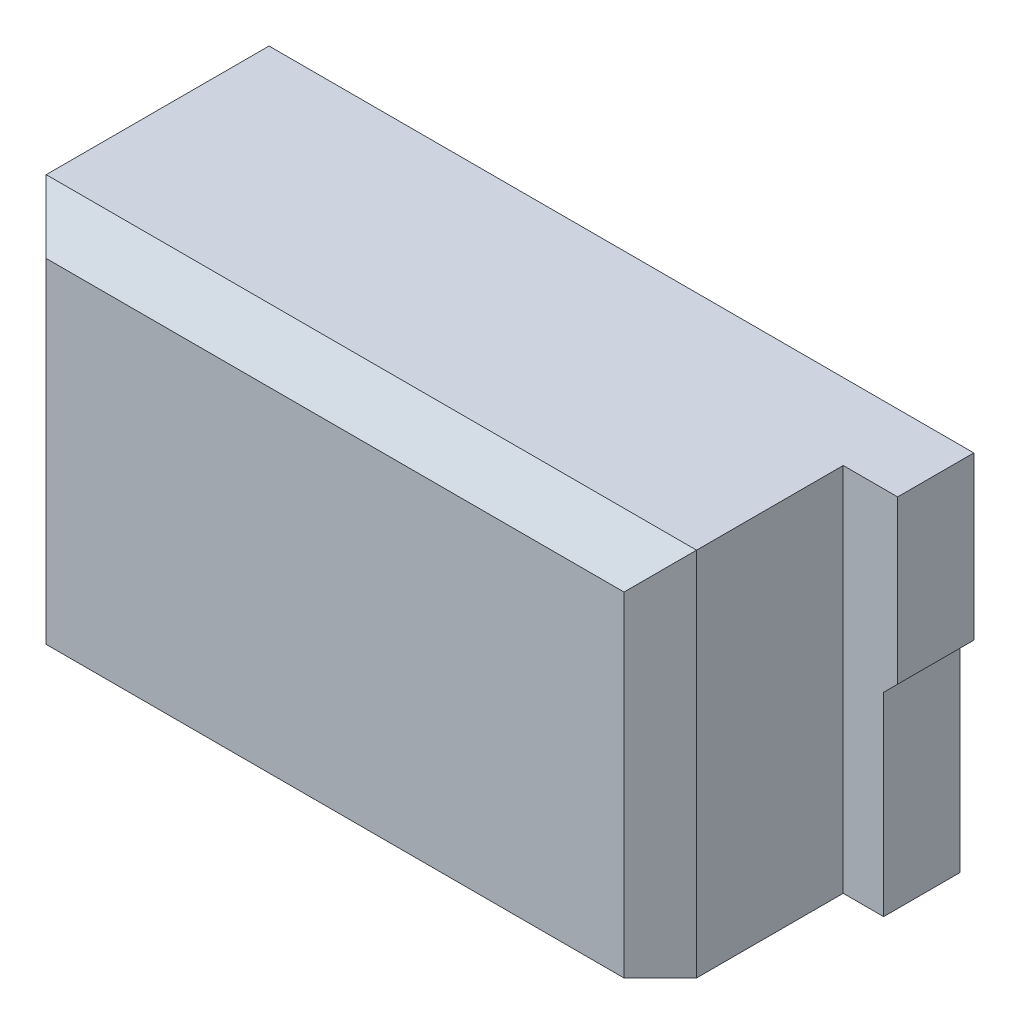
ISO-10303-21;
HEADER;
FILE_DESCRIPTION(('STEP AP214'),'2;1');
FILE_NAME('part.step','',(''),(''),'','','');
FILE_SCHEMA(('AUTOMOTIVE_DESIGN { 1 0 10303 214 1 1 1 1 }'));
ENDSEC;
DATA;
#1=APPLICATION_CONTEXT('core data for automotive mechanical design processes');
#2=APPLICATION_PROTOCOL_DEFINITION('international standard','automotive_design',2000,#1);
#3=PRODUCT_CONTEXT('',#1,'mechanical');
#4=PRODUCT('Part','Part','',(#3));
#5=PRODUCT_RELATED_PRODUCT_CATEGORY('part','',(#4));
#6=PRODUCT_DEFINITION_FORMATION('','',#4);
#7=PRODUCT_DEFINITION_CONTEXT('part definition',#1,'design');
#8=PRODUCT_DEFINITION('design','',#6,#7);
#9=PRODUCT_DEFINITION_SHAPE('','',#8);
#10=(LENGTH_UNIT() NAMED_UNIT(*) SI_UNIT(.MILLI.,.METRE.));
#11=(NAMED_UNIT(*) PLANE_ANGLE_UNIT() SI_UNIT($,.RADIAN.));
#12=(NAMED_UNIT(*) SI_UNIT($,.STERADIAN.) SOLID_ANGLE_UNIT());
#13=UNCERTAINTY_MEASURE_WITH_UNIT(LENGTH_MEASURE(1.E-05),#10,'distance_accuracy_value','');
#14=(GEOMETRIC_REPRESENTATION_CONTEXT(3) GLOBAL_UNCERTAINTY_ASSIGNED_CONTEXT((#13)) GLOBAL_UNIT_ASSIGNED_CONTEXT((#10,
#11,#12)) REPRESENTATION_CONTEXT('',''));
#15=CARTESIAN_POINT('',(0.,0.,0.));
#16=DIRECTION('',(0.,0.,1.));
#17=DIRECTION('',(1.,0.,0.));
#18=AXIS2_PLACEMENT_3D('',#15,#16,#17);
#19=CARTESIAN_POINT('',(64.75,-27.75,0.));
#20=DIRECTION('',(0.,0.,1.));
#21=DIRECTION('',(1.,0.,0.));
#22=AXIS2_PLACEMENT_3D('',#19,#20,#21);
#23=CYLINDRICAL_SURFACE('',#22,2.6);
#24=DIRECTION('',(0.,0.,1.));
#25=VECTOR('',#24,1.);
#26=CARTESIAN_POINT('',(62.15,-27.75,0.));
#27=LINE('',#26,#25);
#28=CARTESIAN_POINT('',(62.15,-27.75,0.));
#29=VERTEX_POINT('',#28);
#30=CARTESIAN_POINT('',(62.15,-27.75,3.1));
#31=VERTEX_POINT('',#30);
#32=EDGE_CURVE('E233',#29,#31,#27,.T.);
#33=ORIENTED_EDGE('',*,*,#32,.F.);
#34=CARTESIAN_POINT('',(64.75,-27.75,0.));
#35=DIRECTION('',(0.,0.,1.));
#36=DIRECTION('',(1.,0.,0.));
#37=AXIS2_PLACEMENT_3D('',#34,#35,#36);
#38=CIRCLE('',#37,2.6);
#39=CARTESIAN_POINT('',(67.35,-27.75,0.));
#40=VERTEX_POINT('',#39);
#41=EDGE_CURVE('E232',#40,#29,#38,.T.);
#42=ORIENTED_EDGE('',*,*,#41,.F.);
#43=DIRECTION('',(0.,0.,1.));
#44=VECTOR('',#43,1.);
#45=CARTESIAN_POINT('',(67.35,-27.75,0.));
#46=LINE('',#45,#44);
#47=CARTESIAN_POINT('',(67.35,-27.75,3.1));
#48=VERTEX_POINT('',#47);
#49=EDGE_CURVE('E430',#40,#48,#46,.T.);
#50=ORIENTED_EDGE('',*,*,#49,.T.);
#51=CARTESIAN_POINT('',(64.75,-27.75,3.1));
#52=DIRECTION('',(0.,0.,1.));
#53=DIRECTION('',(1.,0.,0.));
#54=AXIS2_PLACEMENT_3D('',#51,#52,#53);
#55=CIRCLE('',#54,2.6);
#56=EDGE_CURVE('E11',#48,#31,#55,.T.);
#57=ORIENTED_EDGE('',*,*,#56,.T.);
#58=EDGE_LOOP('',(#33,#42,#50,#57));
#59=FACE_BOUND('',#58,.T.);
#60=ADVANCED_FACE('F17',(#59),#23,.F.);
#61=CARTESIAN_POINT('',(64.75,-27.75,3.1));
#62=DIRECTION('',(0.,0.,-1.));
#63=DIRECTION('',(0.,-1.,0.));
#64=AXIS2_PLACEMENT_3D('',#61,#62,#63);
#65=PLANE('',#64);
#66=ORIENTED_EDGE('',*,*,#56,.F.);
#67=CARTESIAN_POINT('',(64.75,-27.75,3.1));
#68=DIRECTION('',(0.,0.,1.));
#69=DIRECTION('',(1.,0.,0.));
#70=AXIS2_PLACEMENT_3D('',#67,#68,#69);
#71=CIRCLE('',#70,2.6);
#72=EDGE_CURVE('E237',#31,#48,#71,.T.);
#73=ORIENTED_EDGE('',*,*,#72,.F.);
#74=EDGE_LOOP('',(#66,#73));
#75=FACE_BOUND('',#74,.T.);
#76=ADVANCED_FACE('F966',(#75),#65,.T.);
#77=CARTESIAN_POINT('',(-54.75,27.75,0.));
#78=DIRECTION('',(0.,0.,1.));
#79=DIRECTION('',(1.,0.,0.));
#80=AXIS2_PLACEMENT_3D('',#77,#78,#79);
#81=CYLINDRICAL_SURFACE('',#80,2.6);
#82=DIRECTION('',(0.,0.,1.));
#83=VECTOR('',#82,1.);
#84=CARTESIAN_POINT('',(-57.35,27.75,0.));
#85=LINE('',#84,#83);
#86=CARTESIAN_POINT('',(-57.35,27.75,0.));
#87=VERTEX_POINT('',#86);
#88=CARTESIAN_POINT('',(-57.35,27.75,3.1));
#89=VERTEX_POINT('',#88);
#90=EDGE_CURVE('E239',#87,#89,#85,.T.);
#91=ORIENTED_EDGE('',*,*,#90,.F.);
#92=CARTESIAN_POINT('',(-54.75,27.75,0.));
#93=DIRECTION('',(0.,0.,1.));
#94=DIRECTION('',(1.,0.,0.));
#95=AXIS2_PLACEMENT_3D('',#92,#93,#94);
#96=CIRCLE('',#95,2.6);
#97=CARTESIAN_POINT('',(-52.15,27.75,0.));
#98=VERTEX_POINT('',#97);
#99=EDGE_CURVE('E303',#98,#87,#96,.T.);
#100=ORIENTED_EDGE('',*,*,#99,.F.);
#101=DIRECTION('',(0.,0.,1.));
#102=VECTOR('',#101,1.);
#103=CARTESIAN_POINT('',(-52.15,27.75,0.));
#104=LINE('',#103,#102);
#105=CARTESIAN_POINT('',(-52.15,27.75,3.1));
#106=VERTEX_POINT('',#105);
#107=EDGE_CURVE('E399',#98,#106,#104,.T.);
#108=ORIENTED_EDGE('',*,*,#107,.T.);
#109=CARTESIAN_POINT('',(-54.75,27.75,3.1));
#110=DIRECTION('',(0.,0.,1.));
#111=DIRECTION('',(1.,0.,0.));
#112=AXIS2_PLACEMENT_3D('',#109,#110,#111);
#113=CIRCLE('',#112,2.6);
#114=EDGE_CURVE('E28',#106,#89,#113,.T.);
#115=ORIENTED_EDGE('',*,*,#114,.T.);
#116=EDGE_LOOP('',(#91,#100,#108,#115));
#117=FACE_BOUND('',#116,.T.);
#118=ADVANCED_FACE('F1025',(#117),#81,.F.);
#119=CARTESIAN_POINT('',(-54.75,27.75,3.1));
#120=DIRECTION('',(0.,0.,-1.));
#121=DIRECTION('',(0.,-1.,0.));
#122=AXIS2_PLACEMENT_3D('',#119,#120,#121);
#123=PLANE('',#122);
#124=ORIENTED_EDGE('',*,*,#114,.F.);
#125=CARTESIAN_POINT('',(-54.75,27.75,3.1));
#126=DIRECTION('',(0.,0.,1.));
#127=DIRECTION('',(1.,0.,0.));
#128=AXIS2_PLACEMENT_3D('',#125,#126,#127);
#129=CIRCLE('',#128,2.6);
#130=EDGE_CURVE('E243',#89,#106,#129,.T.);
#131=ORIENTED_EDGE('',*,*,#130,.F.);
#132=EDGE_LOOP('',(#124,#131));
#133=FACE_BOUND('',#132,.T.);
#134=ADVANCED_FACE('F1307',(#133),#123,.T.);
#135=CARTESIAN_POINT('',(64.75,27.75,0.));
#136=DIRECTION('',(0.,0.,1.));
#137=DIRECTION('',(1.,0.,0.));
#138=AXIS2_PLACEMENT_3D('',#135,#136,#137);
#139=CYLINDRICAL_SURFACE('',#138,2.6);
#140=DIRECTION('',(0.,0.,1.));
#141=VECTOR('',#140,1.);
#142=CARTESIAN_POINT('',(62.15,27.75,0.));
#143=LINE('',#142,#141);
#144=CARTESIAN_POINT('',(62.15,27.75,0.));
#145=VERTEX_POINT('',#144);
#146=CARTESIAN_POINT('',(62.15,27.75,3.1));
#147=VERTEX_POINT('',#146);
#148=EDGE_CURVE('E429',#145,#147,#143,.T.);
#149=ORIENTED_EDGE('',*,*,#148,.F.);
#150=CARTESIAN_POINT('',(64.75,27.75,0.));
#151=DIRECTION('',(0.,0.,1.));
#152=DIRECTION('',(1.,0.,0.));
#153=AXIS2_PLACEMENT_3D('',#150,#151,#152);
#154=CIRCLE('',#153,2.6);
#155=CARTESIAN_POINT('',(67.35,27.75,0.));
#156=VERTEX_POINT('',#155);
#157=EDGE_CURVE('E307',#156,#145,#154,.T.);
#158=ORIENTED_EDGE('',*,*,#157,.F.);
#159=DIRECTION('',(0.,0.,1.));
#160=VECTOR('',#159,1.);
#161=CARTESIAN_POINT('',(67.35,27.75,0.));
#162=LINE('',#161,#160);
#163=CARTESIAN_POINT('',(67.35,27.75,3.1));
#164=VERTEX_POINT('',#163);
#165=EDGE_CURVE('E266',#156,#164,#162,.T.);
#166=ORIENTED_EDGE('',*,*,#165,.T.);
#167=CARTESIAN_POINT('',(64.75,27.75,3.1));
#168=DIRECTION('',(0.,0.,1.));
#169=DIRECTION('',(1.,0.,0.));
#170=AXIS2_PLACEMENT_3D('',#167,#168,#169);
#171=CIRCLE('',#170,2.6);
#172=EDGE_CURVE('E224',#164,#147,#171,.T.);
#173=ORIENTED_EDGE('',*,*,#172,.T.);
#174=EDGE_LOOP('',(#149,#158,#166,#173));
#175=FACE_BOUND('',#174,.T.);
#176=ADVANCED_FACE('F1055',(#175),#139,.F.);
#177=CARTESIAN_POINT('',(64.75,27.75,3.1));
#178=DIRECTION('',(0.,0.,-1.));
#179=DIRECTION('',(0.,-1.,0.));
#180=AXIS2_PLACEMENT_3D('',#177,#178,#179);
#181=PLANE('',#180);
#182=ORIENTED_EDGE('',*,*,#172,.F.);
#183=CARTESIAN_POINT('',(64.75,27.75,3.1));
#184=DIRECTION('',(0.,0.,1.));
#185=DIRECTION('',(1.,0.,0.));
#186=AXIS2_PLACEMENT_3D('',#183,#184,#185);
#187=CIRCLE('',#186,2.6);
#188=EDGE_CURVE('E370',#147,#164,#187,.T.);
#189=ORIENTED_EDGE('',*,*,#188,.F.);
#190=EDGE_LOOP('',(#182,#189));
#191=FACE_BOUND('',#190,.T.);
#192=ADVANCED_FACE('F1049',(#191),#181,.T.);
#193=CARTESIAN_POINT('',(-54.75,-27.75,0.));
#194=DIRECTION('',(0.,0.,1.));
#195=DIRECTION('',(1.,0.,0.));
#196=AXIS2_PLACEMENT_3D('',#193,#194,#195);
#197=CYLINDRICAL_SURFACE('',#196,2.6);
#198=DIRECTION('',(0.,0.,1.));
#199=VECTOR('',#198,1.);
#200=CARTESIAN_POINT('',(-57.35,-27.75,0.));
#201=LINE('',#200,#199);
#202=CARTESIAN_POINT('',(-57.35,-27.75,0.));
#203=VERTEX_POINT('',#202);
#204=CARTESIAN_POINT('',(-57.35,-27.75,3.1));
#205=VERTEX_POINT('',#204);
#206=EDGE_CURVE('E260',#203,#205,#201,.T.);
#207=ORIENTED_EDGE('',*,*,#206,.F.);
#208=CARTESIAN_POINT('',(-54.75,-27.75,0.));
#209=DIRECTION('',(0.,0.,1.));
#210=DIRECTION('',(1.,0.,0.));
#211=AXIS2_PLACEMENT_3D('',#208,#209,#210);
#212=CIRCLE('',#211,2.6);
#213=CARTESIAN_POINT('',(-52.15,-27.75,0.));
#214=VERTEX_POINT('',#213);
#215=EDGE_CURVE('E420',#214,#203,#212,.T.);
#216=ORIENTED_EDGE('',*,*,#215,.F.);
#217=DIRECTION('',(0.,0.,1.));
#218=VECTOR('',#217,1.);
#219=CARTESIAN_POINT('',(-52.15,-27.75,0.));
#220=LINE('',#219,#218);
#221=CARTESIAN_POINT('',(-52.15,-27.75,3.1));
#222=VERTEX_POINT('',#221);
#223=EDGE_CURVE('E259',#214,#222,#220,.T.);
#224=ORIENTED_EDGE('',*,*,#223,.T.);
#225=CARTESIAN_POINT('',(-54.75,-27.75,3.1));
#226=DIRECTION('',(0.,0.,1.));
#227=DIRECTION('',(1.,0.,0.));
#228=AXIS2_PLACEMENT_3D('',#225,#226,#227);
#229=CIRCLE('',#228,2.6);
#230=EDGE_CURVE('E220',#222,#205,#229,.T.);
#231=ORIENTED_EDGE('',*,*,#230,.T.);
#232=EDGE_LOOP('',(#207,#216,#224,#231));
#233=FACE_BOUND('',#232,.T.);
#234=ADVANCED_FACE('F1054',(#233),#197,.F.);
#235=CARTESIAN_POINT('',(-54.75,-27.75,3.1));
#236=DIRECTION('',(0.,0.,-1.));
#237=DIRECTION('',(0.,-1.,0.));
#238=AXIS2_PLACEMENT_3D('',#235,#236,#237);
#239=PLANE('',#238);
#240=ORIENTED_EDGE('',*,*,#230,.F.);
#241=CARTESIAN_POINT('',(-54.75,-27.75,3.1));
#242=DIRECTION('',(0.,0.,1.));
#243=DIRECTION('',(1.,0.,0.));
#244=AXIS2_PLACEMENT_3D('',#241,#242,#243);
#245=CIRCLE('',#244,2.6);
#246=EDGE_CURVE('E255',#205,#222,#245,.T.);
#247=ORIENTED_EDGE('',*,*,#246,.F.);
#248=EDGE_LOOP('',(#240,#247));
#249=FACE_BOUND('',#248,.T.);
#250=ADVANCED_FACE('F1011',(#249),#239,.T.);
#251=CARTESIAN_POINT('',(-49.75,22.75,0.));
#252=DIRECTION('',(1.,0.,0.));
#253=DIRECTION('',(0.,1.,0.));
#254=AXIS2_PLACEMENT_3D('',#251,#252,#253);
#255=PLANE('',#254);
#256=DIRECTION('',(0.,-1.,0.));
#257=VECTOR('',#256,1.);
#258=CARTESIAN_POINT('',(-49.75,32.75,0.));
#259=LINE('',#258,#257);
#260=CARTESIAN_POINT('',(-49.75,32.75,0.));
#261=VERTEX_POINT('',#260);
#262=CARTESIAN_POINT('',(-49.75,22.75,0.));
#263=VERTEX_POINT('',#262);
#264=EDGE_CURVE('E511',#261,#263,#259,.T.);
#265=ORIENTED_EDGE('',*,*,#264,.F.);
#266=DIRECTION('',(0.,0.,-1.));
#267=VECTOR('',#266,1.);
#268=CARTESIAN_POINT('',(-49.75,32.75,0.));
#269=LINE('',#268,#267);
#270=CARTESIAN_POINT('',(-49.75,32.75,10.));
#271=VERTEX_POINT('',#270);
#272=EDGE_CURVE('E280',#271,#261,#269,.T.);
#273=ORIENTED_EDGE('',*,*,#272,.F.);
#274=DIRECTION('',(0.,1.,0.));
#275=VECTOR('',#274,1.);
#276=CARTESIAN_POINT('',(-49.75,32.75,10.));
#277=LINE('',#276,#275);
#278=CARTESIAN_POINT('',(-49.75,22.75,10.));
#279=VERTEX_POINT('',#278);
#280=EDGE_CURVE('E212',#279,#271,#277,.T.);
#281=ORIENTED_EDGE('',*,*,#280,.F.);
#282=DIRECTION('',(0.,0.,1.));
#283=VECTOR('',#282,1.);
#284=CARTESIAN_POINT('',(-49.75,22.75,0.));
#285=LINE('',#284,#283);
#286=EDGE_CURVE('E43',#263,#279,#285,.T.);
#287=ORIENTED_EDGE('',*,*,#286,.F.);
#288=EDGE_LOOP('',(#265,#273,#281,#287));
#289=FACE_BOUND('',#288,.T.);
#290=ADVANCED_FACE('F1000',(#289),#255,.T.);
#291=CARTESIAN_POINT('',(-59.75,22.75,0.));
#292=DIRECTION('',(0.,-1.,0.));
#293=DIRECTION('',(0.,0.,-1.));
#294=AXIS2_PLACEMENT_3D('',#291,#292,#293);
#295=PLANE('',#294);
#296=DIRECTION('',(-1.,0.,0.));
#297=VECTOR('',#296,1.);
#298=CARTESIAN_POINT('',(-49.75,22.75,0.));
#299=LINE('',#298,#297);
#300=CARTESIAN_POINT('',(-59.75,22.75,0.));
#301=VERTEX_POINT('',#300);
#302=EDGE_CURVE('E21',#263,#301,#299,.T.);
#303=ORIENTED_EDGE('',*,*,#302,.F.);
#304=ORIENTED_EDGE('',*,*,#286,.T.);
#305=DIRECTION('',(1.,0.,0.));
#306=VECTOR('',#305,1.);
#307=CARTESIAN_POINT('',(-49.75,22.75,10.));
#308=LINE('',#307,#306);
#309=CARTESIAN_POINT('',(-59.75,22.75,10.));
#310=VERTEX_POINT('',#309);
#311=EDGE_CURVE('E208',#310,#279,#308,.T.);
#312=ORIENTED_EDGE('',*,*,#311,.F.);
#313=DIRECTION('',(0.,0.,1.));
#314=VECTOR('',#313,1.);
#315=CARTESIAN_POINT('',(-59.75,22.75,0.));
#316=LINE('',#315,#314);
#317=EDGE_CURVE('E191',#301,#310,#316,.T.);
#318=ORIENTED_EDGE('',*,*,#317,.F.);
#319=EDGE_LOOP('',(#303,#304,#312,#318));
#320=FACE_BOUND('',#319,.T.);
#321=ADVANCED_FACE('F1001',(#320),#295,.T.);
#322=CARTESIAN_POINT('',(-54.75,27.75,10.));
#323=DIRECTION('',(0.,0.,1.));
#324=DIRECTION('',(1.,0.,0.));
#325=AXIS2_PLACEMENT_3D('',#322,#323,#324);
#326=PLANE('',#325);
#327=DIRECTION('',(0.,1.,0.));
#328=VECTOR('',#327,1.);
#329=CARTESIAN_POINT('',(-59.75,31.75,10.));
#330=LINE('',#329,#328);
#331=CARTESIAN_POINT('',(-59.75,32.75,10.));
#332=VERTEX_POINT('',#331);
#333=EDGE_CURVE('E332',#310,#332,#330,.T.);
#334=ORIENTED_EDGE('',*,*,#333,.F.);
#335=ORIENTED_EDGE('',*,*,#311,.T.);
#336=ORIENTED_EDGE('',*,*,#280,.T.);
#337=DIRECTION('',(1.,0.,0.));
#338=VECTOR('',#337,1.);
#339=CARTESIAN_POINT('',(3.99999999999995,32.75,10.));
#340=LINE('',#339,#338);
#341=EDGE_CURVE('E321',#332,#271,#340,.T.);
#342=ORIENTED_EDGE('',*,*,#341,.F.);
#343=EDGE_LOOP('',(#334,#335,#336,#342));
#344=FACE_BOUND('',#343,.T.);
#345=ADVANCED_FACE('F1163',(#344),#326,.T.);
#346=CARTESIAN_POINT('',(-49.75,-32.75,0.));
#347=DIRECTION('',(1.,0.,0.));
#348=DIRECTION('',(0.,1.,0.));
#349=AXIS2_PLACEMENT_3D('',#346,#347,#348);
#350=PLANE('',#349);
#351=DIRECTION('',(0.,1.,0.));
#352=VECTOR('',#351,1.);
#353=CARTESIAN_POINT('',(-49.75,-32.75,0.));
#354=LINE('',#353,#352);
#355=CARTESIAN_POINT('',(-49.75,-32.75,0.));
#356=VERTEX_POINT('',#355);
#357=CARTESIAN_POINT('',(-49.75,-22.75,0.));
#358=VERTEX_POINT('',#357);
#359=EDGE_CURVE('E461',#356,#358,#354,.T.);
#360=ORIENTED_EDGE('',*,*,#359,.T.);
#361=DIRECTION('',(0.,0.,1.));
#362=VECTOR('',#361,1.);
#363=CARTESIAN_POINT('',(-49.75,-22.75,0.));
#364=LINE('',#363,#362);
#365=CARTESIAN_POINT('',(-49.75,-22.75,10.));
#366=VERTEX_POINT('',#365);
#367=EDGE_CURVE('E213',#358,#366,#364,.T.);
#368=ORIENTED_EDGE('',*,*,#367,.T.);
#369=DIRECTION('',(0.,1.,0.));
#370=VECTOR('',#369,1.);
#371=CARTESIAN_POINT('',(-49.75,-32.75,10.));
#372=LINE('',#371,#370);
#373=CARTESIAN_POINT('',(-49.75,-32.75,10.));
#374=VERTEX_POINT('',#373);
#375=EDGE_CURVE('E405',#374,#366,#372,.T.);
#376=ORIENTED_EDGE('',*,*,#375,.F.);
#377=DIRECTION('',(0.,0.,1.));
#378=VECTOR('',#377,1.);
#379=CARTESIAN_POINT('',(-49.75,-32.75,0.));
#380=LINE('',#379,#378);
#381=EDGE_CURVE('E358',#356,#374,#380,.T.);
#382=ORIENTED_EDGE('',*,*,#381,.F.);
#383=EDGE_LOOP('',(#360,#368,#376,#382));
#384=FACE_BOUND('',#383,.T.);
#385=ADVANCED_FACE('F19',(#384),#350,.T.);
#386=CARTESIAN_POINT('',(-49.75,-22.75,0.));
#387=DIRECTION('',(0.,1.,0.));
#388=DIRECTION('',(1.,0.,0.));
#389=AXIS2_PLACEMENT_3D('',#386,#387,#388);
#390=PLANE('',#389);
#391=DIRECTION('',(-1.,0.,0.));
#392=VECTOR('',#391,1.);
#393=CARTESIAN_POINT('',(-49.75,-22.75,0.));
#394=LINE('',#393,#392);
#395=CARTESIAN_POINT('',(-59.75,-22.75,0.));
#396=VERTEX_POINT('',#395);
#397=EDGE_CURVE('E336',#358,#396,#394,.T.);
#398=ORIENTED_EDGE('',*,*,#397,.T.);
#399=DIRECTION('',(0.,0.,-1.));
#400=VECTOR('',#399,1.);
#401=CARTESIAN_POINT('',(-59.75,-22.75,0.));
#402=LINE('',#401,#400);
#403=CARTESIAN_POINT('',(-59.75,-22.75,10.));
#404=VERTEX_POINT('',#403);
#405=EDGE_CURVE('E199',#404,#396,#402,.T.);
#406=ORIENTED_EDGE('',*,*,#405,.F.);
#407=DIRECTION('',(-1.,0.,0.));
#408=VECTOR('',#407,1.);
#409=CARTESIAN_POINT('',(-49.75,-22.75,10.));
#410=LINE('',#409,#408);
#411=EDGE_CURVE('E357',#366,#404,#410,.T.);
#412=ORIENTED_EDGE('',*,*,#411,.F.);
#413=ORIENTED_EDGE('',*,*,#367,.F.);
#414=EDGE_LOOP('',(#398,#406,#412,#413));
#415=FACE_BOUND('',#414,.T.);
#416=ADVANCED_FACE('F991',(#415),#390,.T.);
#417=CARTESIAN_POINT('',(-54.75,-27.75,10.));
#418=DIRECTION('',(0.,0.,1.));
#419=DIRECTION('',(1.,0.,0.));
#420=AXIS2_PLACEMENT_3D('',#417,#418,#419);
#421=PLANE('',#420);
#422=ORIENTED_EDGE('',*,*,#411,.T.);
#423=DIRECTION('',(0.,1.,0.));
#424=VECTOR('',#423,1.);
#425=CARTESIAN_POINT('',(-59.75,4.,10.));
#426=LINE('',#425,#424);
#427=CARTESIAN_POINT('',(-59.75,-32.75,10.));
#428=VERTEX_POINT('',#427);
#429=EDGE_CURVE('E376',#428,#404,#426,.T.);
#430=ORIENTED_EDGE('',*,*,#429,.F.);
#431=DIRECTION('',(-1.,0.,0.));
#432=VECTOR('',#431,1.);
#433=CARTESIAN_POINT('',(-58.75,-32.75,10.));
#434=LINE('',#433,#432);
#435=EDGE_CURVE('E353',#374,#428,#434,.T.);
#436=ORIENTED_EDGE('',*,*,#435,.F.);
#437=ORIENTED_EDGE('',*,*,#375,.T.);
#438=EDGE_LOOP('',(#422,#430,#436,#437));
#439=FACE_BOUND('',#438,.T.);
#440=ADVANCED_FACE('F1149',(#439),#421,.T.);
#441=CARTESIAN_POINT('',(-62.75,-32.75,0.));
#442=DIRECTION('',(0.,-1.,0.));
#443=DIRECTION('',(0.,0.,-1.));
#444=AXIS2_PLACEMENT_3D('',#441,#442,#443);
#445=PLANE('',#444);
#446=CARTESIAN_POINT('',(33.25,-32.75,23.5));
#447=DIRECTION('',(0.,-1.,0.));
#448=DIRECTION('',(1.,0.,0.));
#449=AXIS2_PLACEMENT_3D('',#446,#447,#448);
#450=CIRCLE('',#449,17.5);
#451=CARTESIAN_POINT('',(50.75,-32.75,23.5));
#452=VERTEX_POINT('',#451);
#453=CARTESIAN_POINT('',(15.75,-32.75,23.5));
#454=VERTEX_POINT('',#453);
#455=EDGE_CURVE('E504',#452,#454,#450,.T.);
#456=ORIENTED_EDGE('',*,*,#455,.T.);
#457=CARTESIAN_POINT('',(33.25,-32.75,23.5));
#458=DIRECTION('',(0.,-1.,0.));
#459=DIRECTION('',(1.,0.,0.));
#460=AXIS2_PLACEMENT_3D('',#457,#458,#459);
#461=CIRCLE('',#460,17.5);
#462=EDGE_CURVE('E362',#454,#452,#461,.T.);
#463=ORIENTED_EDGE('',*,*,#462,.T.);
#464=EDGE_LOOP('',(#456,#463));
#465=FACE_BOUND('',#464,.T.);
#466=ORIENTED_EDGE('',*,*,#381,.T.);
#467=ORIENTED_EDGE('',*,*,#435,.T.);
#468=DIRECTION('',(0.,0.,1.));
#469=VECTOR('',#468,1.);
#470=CARTESIAN_POINT('',(-59.75,-32.75,0.));
#471=LINE('',#470,#469);
#472=CARTESIAN_POINT('',(-59.75,-32.75,41.7573593128807));
#473=VERTEX_POINT('',#472);
#474=EDGE_CURVE('E380',#428,#473,#471,.T.);
#475=ORIENTED_EDGE('',*,*,#474,.T.);
#476=DIRECTION('',(0.707106781186548,0.,0.707106781186548));
#477=VECTOR('',#476,1.);
#478=CARTESIAN_POINT('',(-69.6286796564404,-32.75,31.8786796564404));
#479=LINE('',#478,#477);
#480=CARTESIAN_POINT('',(-54.5073593128808,-32.75,47.));
#481=VERTEX_POINT('',#480);
#482=EDGE_CURVE('E181',#473,#481,#479,.T.);
#483=ORIENTED_EDGE('',*,*,#482,.T.);
#484=DIRECTION('',(1.,0.,0.));
#485=VECTOR('',#484,1.);
#486=CARTESIAN_POINT('',(-31.375,-32.75,47.));
#487=LINE('',#486,#485);
#488=CARTESIAN_POINT('',(54.5073593128807,-32.75,47.));
#489=VERTEX_POINT('',#488);
#490=EDGE_CURVE('E177',#481,#489,#487,.T.);
#491=ORIENTED_EDGE('',*,*,#490,.T.);
#492=DIRECTION('',(0.707106781186548,0.,-0.707106781186548));
#493=VECTOR('',#492,1.);
#494=CARTESIAN_POINT('',(38.2536796564403,-32.75,63.2536796564404));
#495=LINE('',#494,#493);
#496=CARTESIAN_POINT('',(59.75,-32.75,41.7573593128807));
#497=VERTEX_POINT('',#496);
#498=EDGE_CURVE('E163',#489,#497,#495,.T.);
#499=ORIENTED_EDGE('',*,*,#498,.T.);
#500=DIRECTION('',(0.,0.,1.));
#501=VECTOR('',#500,1.);
#502=CARTESIAN_POINT('',(59.75,-32.75,0.));
#503=LINE('',#502,#501);
#504=CARTESIAN_POINT('',(59.75,-32.75,0.));
#505=VERTEX_POINT('',#504);
#506=EDGE_CURVE('E270',#505,#497,#503,.T.);
#507=ORIENTED_EDGE('',*,*,#506,.F.);
#508=DIRECTION('',(1.,0.,0.));
#509=VECTOR('',#508,1.);
#510=CARTESIAN_POINT('',(-31.375,-32.75,0.));
#511=LINE('',#510,#509);
#512=EDGE_CURVE('E298',#356,#505,#511,.T.);
#513=ORIENTED_EDGE('',*,*,#512,.F.);
#514=EDGE_LOOP('',(#466,#467,#475,#483,#491,#499,#507,#513));
#515=FACE_BOUND('',#514,.T.);
#516=ADVANCED_FACE('F179',(#465,#515),#445,.F.);
#517=CARTESIAN_POINT('',(33.25,-35.75,23.5));
#518=DIRECTION('',(0.,1.,0.));
#519=DIRECTION('',(1.,0.,0.));
#520=AXIS2_PLACEMENT_3D('',#517,#518,#519);
#521=CYLINDRICAL_SURFACE('',#520,17.5);
#522=DIRECTION('',(0.,1.,0.));
#523=VECTOR('',#522,1.);
#524=CARTESIAN_POINT('',(15.75,-35.75,23.5));
#525=LINE('',#524,#523);
#526=CARTESIAN_POINT('',(15.75,-35.75,23.5));
#527=VERTEX_POINT('',#526);
#528=EDGE_CURVE('E500',#527,#454,#525,.T.);
#529=ORIENTED_EDGE('',*,*,#528,.F.);
#530=CARTESIAN_POINT('',(33.25,-35.75,23.5));
#531=DIRECTION('',(0.,1.,0.));
#532=DIRECTION('',(1.,0.,0.));
#533=AXIS2_PLACEMENT_3D('',#530,#531,#532);
#534=CIRCLE('',#533,17.5);
#535=CARTESIAN_POINT('',(50.75,-35.75,23.5));
#536=VERTEX_POINT('',#535);
#537=EDGE_CURVE('E308',#536,#527,#534,.T.);
#538=ORIENTED_EDGE('',*,*,#537,.F.);
#539=DIRECTION('',(0.,1.,0.));
#540=VECTOR('',#539,1.);
#541=CARTESIAN_POINT('',(50.75,-35.75,23.5));
#542=LINE('',#541,#540);
#543=EDGE_CURVE('E342',#536,#452,#542,.T.);
#544=ORIENTED_EDGE('',*,*,#543,.T.);
#545=ORIENTED_EDGE('',*,*,#462,.F.);
#546=EDGE_LOOP('',(#529,#538,#544,#545));
#547=FACE_BOUND('',#546,.T.);
#548=ADVANCED_FACE('F1221',(#547),#521,.F.);
#549=CARTESIAN_POINT('',(73.25,4.45,0.));
#550=DIRECTION('',(1.,0.,0.));
#551=DIRECTION('',(0.,-1.,0.));
#552=AXIS2_PLACEMENT_3D('',#549,#550,#551);
#553=PLANE('',#552);
#554=DIRECTION('',(0.,1.,0.));
#555=VECTOR('',#554,1.);
#556=CARTESIAN_POINT('',(73.25,4.45,0.));
#557=LINE('',#556,#555);
#558=CARTESIAN_POINT('',(73.25,4.45,0.));
#559=VERTEX_POINT('',#558);
#560=CARTESIAN_POINT('',(73.25,35.75,0.));
#561=VERTEX_POINT('',#560);
#562=EDGE_CURVE('E348',#559,#561,#557,.T.);
#563=ORIENTED_EDGE('',*,*,#562,.T.);
#564=DIRECTION('',(0.,0.,1.));
#565=VECTOR('',#564,1.);
#566=CARTESIAN_POINT('',(73.25,35.75,0.));
#567=LINE('',#566,#565);
#568=CARTESIAN_POINT('',(73.25,35.75,14.7));
#569=VERTEX_POINT('',#568);
#570=EDGE_CURVE('E250',#561,#569,#567,.T.);
#571=ORIENTED_EDGE('',*,*,#570,.T.);
#572=DIRECTION('',(0.,1.,0.));
#573=VECTOR('',#572,1.);
#574=CARTESIAN_POINT('',(73.25,4.45,14.7));
#575=LINE('',#574,#573);
#576=CARTESIAN_POINT('',(73.25,4.45,14.7));
#577=VERTEX_POINT('',#576);
#578=EDGE_CURVE('E392',#577,#569,#575,.T.);
#579=ORIENTED_EDGE('',*,*,#578,.F.);
#580=DIRECTION('',(0.,0.,1.));
#581=VECTOR('',#580,1.);
#582=CARTESIAN_POINT('',(73.25,4.45,0.));
#583=LINE('',#582,#581);
#584=EDGE_CURVE('E366',#559,#577,#583,.T.);
#585=ORIENTED_EDGE('',*,*,#584,.F.);
#586=EDGE_LOOP('',(#563,#571,#579,#585));
#587=FACE_BOUND('',#586,.T.);
#588=ADVANCED_FACE('F689',(#587),#553,.T.);
#589=CARTESIAN_POINT('',(70.55,1.7500000000001,0.));
#590=DIRECTION('',(0.707106781186546,-0.707106781186549,0.));
#591=DIRECTION('',(0.,0.,-1.));
#592=AXIS2_PLACEMENT_3D('',#589,#590,#591);
#593=PLANE('',#592);
#594=DIRECTION('',(0.707106781186549,0.707106781186546,0.));
#595=VECTOR('',#594,1.);
#596=CARTESIAN_POINT('',(70.55,1.7500000000001,0.));
#597=LINE('',#596,#595);
#598=CARTESIAN_POINT('',(70.55,1.7500000000001,0.));
#599=VERTEX_POINT('',#598);
#600=EDGE_CURVE('E343',#599,#559,#597,.T.);
#601=ORIENTED_EDGE('',*,*,#600,.T.);
#602=ORIENTED_EDGE('',*,*,#584,.T.);
#603=DIRECTION('',(0.707106781186549,0.707106781186546,0.));
#604=VECTOR('',#603,1.);
#605=CARTESIAN_POINT('',(70.55,1.7500000000001,14.7));
#606=LINE('',#605,#604);
#607=CARTESIAN_POINT('',(70.55,1.7500000000001,14.7));
#608=VERTEX_POINT('',#607);
#609=EDGE_CURVE('E352',#608,#577,#606,.T.);
#610=ORIENTED_EDGE('',*,*,#609,.F.);
#611=DIRECTION('',(0.,0.,1.));
#612=VECTOR('',#611,1.);
#613=CARTESIAN_POINT('',(70.55,1.7500000000001,0.));
#614=LINE('',#613,#612);
#615=EDGE_CURVE('E393',#599,#608,#614,.T.);
#616=ORIENTED_EDGE('',*,*,#615,.F.);
#617=EDGE_LOOP('',(#601,#602,#610,#616));
#618=FACE_BOUND('',#617,.T.);
#619=ADVANCED_FACE('F678',(#618),#593,.T.);
#620=CARTESIAN_POINT('',(70.55,-35.75,0.));
#621=DIRECTION('',(1.,0.,0.));
#622=DIRECTION('',(0.,1.,0.));
#623=AXIS2_PLACEMENT_3D('',#620,#621,#622);
#624=PLANE('',#623);
#625=DIRECTION('',(0.,1.,0.));
#626=VECTOR('',#625,1.);
#627=CARTESIAN_POINT('',(70.55,-35.75,0.));
#628=LINE('',#627,#626);
#629=CARTESIAN_POINT('',(70.55,-35.75,0.));
#630=VERTEX_POINT('',#629);
#631=EDGE_CURVE('E347',#630,#599,#628,.T.);
#632=ORIENTED_EDGE('',*,*,#631,.T.);
#633=ORIENTED_EDGE('',*,*,#615,.T.);
#634=DIRECTION('',(0.,1.,0.));
#635=VECTOR('',#634,1.);
#636=CARTESIAN_POINT('',(70.55,-35.75,14.7));
#637=LINE('',#636,#635);
#638=CARTESIAN_POINT('',(70.55,-35.75,14.7));
#639=VERTEX_POINT('',#638);
#640=EDGE_CURVE('E207',#639,#608,#637,.T.);
#641=ORIENTED_EDGE('',*,*,#640,.F.);
#642=DIRECTION('',(0.,0.,1.));
#643=VECTOR('',#642,1.);
#644=CARTESIAN_POINT('',(70.55,-35.75,0.));
#645=LINE('',#644,#643);
#646=EDGE_CURVE('E521',#630,#639,#645,.T.);
#647=ORIENTED_EDGE('',*,*,#646,.F.);
#648=EDGE_LOOP('',(#632,#633,#641,#647));
#649=FACE_BOUND('',#648,.T.);
#650=ADVANCED_FACE('F684',(#649),#624,.T.);
#651=CARTESIAN_POINT('',(68.,0.,14.7));
#652=DIRECTION('',(0.,0.,1.));
#653=DIRECTION('',(1.,0.,0.));
#654=AXIS2_PLACEMENT_3D('',#651,#652,#653);
#655=PLANE('',#654);
#656=DIRECTION('',(-1.,0.,0.));
#657=VECTOR('',#656,1.);
#658=CARTESIAN_POINT('',(73.25,35.75,14.7));
#659=LINE('',#658,#657);
#660=CARTESIAN_POINT('',(62.75,35.75,14.7));
#661=VERTEX_POINT('',#660);
#662=EDGE_CURVE('E254',#569,#661,#659,.T.);
#663=ORIENTED_EDGE('',*,*,#662,.T.);
#664=DIRECTION('',(0.,1.,0.));
#665=VECTOR('',#664,1.);
#666=CARTESIAN_POINT('',(62.75,-17.875,14.7));
#667=LINE('',#666,#665);
#668=CARTESIAN_POINT('',(62.75,-35.75,14.7));
#669=VERTEX_POINT('',#668);
#670=EDGE_CURVE('E204',#669,#661,#667,.T.);
#671=ORIENTED_EDGE('',*,*,#670,.F.);
#672=DIRECTION('',(1.,0.,0.));
#673=VECTOR('',#672,1.);
#674=CARTESIAN_POINT('',(62.75,-35.75,14.7));
#675=LINE('',#674,#673);
#676=EDGE_CURVE('E525',#669,#639,#675,.T.);
#677=ORIENTED_EDGE('',*,*,#676,.T.);
#678=ORIENTED_EDGE('',*,*,#640,.T.);
#679=ORIENTED_EDGE('',*,*,#609,.T.);
#680=ORIENTED_EDGE('',*,*,#578,.T.);
#681=EDGE_LOOP('',(#663,#671,#677,#678,#679,#680));
#682=FACE_BOUND('',#681,.T.);
#683=ADVANCED_FACE('F695',(#682),#655,.T.);
#684=CARTESIAN_POINT('',(62.75,-35.75,0.));
#685=DIRECTION('',(1.,0.,0.));
#686=DIRECTION('',(0.,1.,0.));
#687=AXIS2_PLACEMENT_3D('',#684,#685,#686);
#688=PLANE('',#687);
#689=ORIENTED_EDGE('',*,*,#670,.T.);
#690=DIRECTION('',(0.,0.,1.));
#691=VECTOR('',#690,1.);
#692=CARTESIAN_POINT('',(62.75,35.75,0.));
#693=LINE('',#692,#691);
#694=CARTESIAN_POINT('',(62.75,35.75,43.));
#695=VERTEX_POINT('',#694);
#696=EDGE_CURVE('E465',#661,#695,#693,.T.);
#697=ORIENTED_EDGE('',*,*,#696,.T.);
#698=DIRECTION('',(0.,1.,0.));
#699=VECTOR('',#698,1.);
#700=CARTESIAN_POINT('',(62.75,-17.875,43.));
#701=LINE('',#700,#699);
#702=CARTESIAN_POINT('',(62.75,-35.75,43.));
#703=VERTEX_POINT('',#702);
#704=EDGE_CURVE('E245',#703,#695,#701,.T.);
#705=ORIENTED_EDGE('',*,*,#704,.F.);
#706=DIRECTION('',(0.,0.,1.));
#707=VECTOR('',#706,1.);
#708=CARTESIAN_POINT('',(62.75,-35.75,0.));
#709=LINE('',#708,#707);
#710=EDGE_CURVE('E313',#669,#703,#709,.T.);
#711=ORIENTED_EDGE('',*,*,#710,.F.);
#712=EDGE_LOOP('',(#689,#697,#705,#711));
#713=FACE_BOUND('',#712,.T.);
#714=ADVANCED_FACE('F563',(#713),#688,.T.);
#715=CARTESIAN_POINT('',(-57.1286796564404,17.875,44.3786796564404));
#716=DIRECTION('',(-0.707106781186548,0.,0.707106781186548));
#717=DIRECTION('',(0.,1.,0.));
#718=AXIS2_PLACEMENT_3D('',#715,#716,#717);
#719=PLANE('',#718);
#720=DIRECTION('',(0.,-1.,0.));
#721=VECTOR('',#720,1.);
#722=CARTESIAN_POINT('',(-59.75,26.8125,41.7573593128807));
#723=LINE('',#722,#721);
#724=CARTESIAN_POINT('',(-59.75,32.75,41.7573593128807));
#725=VERTEX_POINT('',#724);
#726=EDGE_CURVE('E361',#725,#473,#723,.T.);
#727=ORIENTED_EDGE('',*,*,#726,.F.);
#728=DIRECTION('',(-0.577350269189626,0.577350269189626,-0.577350269189626));
#729=VECTOR('',#728,1.);
#730=CARTESIAN_POINT('',(-40.335786437627,13.335786437627,61.1715728752538));
#731=LINE('',#730,#729);
#732=CARTESIAN_POINT('',(-54.5073593128808,27.5073593128808,47.));
#733=VERTEX_POINT('',#732);
#734=EDGE_CURVE('E174',#733,#725,#731,.T.);
#735=ORIENTED_EDGE('',*,*,#734,.F.);
#736=DIRECTION('',(0.,1.,0.));
#737=VECTOR('',#736,1.);
#738=CARTESIAN_POINT('',(-54.5073593128808,8.9375,47.));
#739=LINE('',#738,#737);
#740=EDGE_CURVE('E186',#481,#733,#739,.T.);
#741=ORIENTED_EDGE('',*,*,#740,.F.);
#742=ORIENTED_EDGE('',*,*,#482,.F.);
#743=EDGE_LOOP('',(#727,#735,#741,#742));
#744=FACE_BOUND('',#743,.T.);
#745=ADVANCED_FACE('F1197',(#744),#719,.F.);
#746=CARTESIAN_POINT('',(31.375,30.1286796564404,44.3786796564404));
#747=DIRECTION('',(0.,0.707106781186548,0.707106781186548));
#748=DIRECTION('',(1.,0.,0.));
#749=AXIS2_PLACEMENT_3D('',#746,#747,#748);
#750=PLANE('',#749);
#751=DIRECTION('',(-1.,0.,0.));
#752=VECTOR('',#751,1.);
#753=CARTESIAN_POINT('',(47.0625,32.75,41.7573593128807));
#754=LINE('',#753,#752);
#755=CARTESIAN_POINT('',(59.75,32.75,41.7573593128807));
#756=VERTEX_POINT('',#755);
#757=EDGE_CURVE('E302',#756,#725,#754,.T.);
#758=ORIENTED_EDGE('',*,*,#757,.F.);
#759=DIRECTION('',(0.577350269189626,0.577350269189626,-0.577350269189626));
#760=VECTOR('',#759,1.);
#761=CARTESIAN_POINT('',(44.8357864376269,17.8357864376269,56.6715728752538));
#762=LINE('',#761,#760);
#763=CARTESIAN_POINT('',(54.5073593128807,27.5073593128808,47.));
#764=VERTEX_POINT('',#763);
#765=EDGE_CURVE('E153',#764,#756,#762,.T.);
#766=ORIENTED_EDGE('',*,*,#765,.F.);
#767=DIRECTION('',(1.,0.,0.));
#768=VECTOR('',#767,1.);
#769=CARTESIAN_POINT('',(15.6875,27.5073593128808,47.));
#770=LINE('',#769,#768);
#771=EDGE_CURVE('E189',#733,#764,#770,.T.);
#772=ORIENTED_EDGE('',*,*,#771,.F.);
#773=ORIENTED_EDGE('',*,*,#734,.T.);
#774=EDGE_LOOP('',(#758,#766,#772,#773));
#775=FACE_BOUND('',#774,.T.);
#776=ADVANCED_FACE('F1202',(#775),#750,.F.);
#777=CARTESIAN_POINT('',(57.1286796564403,-17.875,44.3786796564404));
#778=DIRECTION('',(0.707106781186548,0.,0.707106781186548));
#779=DIRECTION('',(0.,-1.,0.));
#780=AXIS2_PLACEMENT_3D('',#777,#778,#779);
#781=PLANE('',#780);
#782=DIRECTION('',(0.,-1.,0.));
#783=VECTOR('',#782,1.);
#784=CARTESIAN_POINT('',(54.5073593128807,-8.9375,47.));
#785=LINE('',#784,#783);
#786=EDGE_CURVE('E167',#764,#489,#785,.T.);
#787=ORIENTED_EDGE('',*,*,#786,.F.);
#788=ORIENTED_EDGE('',*,*,#765,.T.);
#789=DIRECTION('',(0.,1.,0.));
#790=VECTOR('',#789,1.);
#791=CARTESIAN_POINT('',(59.75,-26.8125,41.7573593128807));
#792=LINE('',#791,#790);
#793=EDGE_CURVE('E169',#497,#756,#792,.T.);
#794=ORIENTED_EDGE('',*,*,#793,.F.);
#795=ORIENTED_EDGE('',*,*,#498,.F.);
#796=EDGE_LOOP('',(#787,#788,#794,#795));
#797=FACE_BOUND('',#796,.T.);
#798=ADVANCED_FACE('F165',(#797),#781,.F.);
#799=CARTESIAN_POINT('',(0.,0.,47.));
#800=DIRECTION('',(0.,0.,1.));
#801=DIRECTION('',(1.,0.,0.));
#802=AXIS2_PLACEMENT_3D('',#799,#800,#801);
#803=PLANE('',#802);
#804=ORIENTED_EDGE('',*,*,#786,.T.);
#805=ORIENTED_EDGE('',*,*,#490,.F.);
#806=ORIENTED_EDGE('',*,*,#740,.T.);
#807=ORIENTED_EDGE('',*,*,#771,.T.);
#808=EDGE_LOOP('',(#804,#805,#806,#807));
#809=FACE_BOUND('',#808,.T.);
#810=ADVANCED_FACE('F188',(#809),#803,.F.);
#811=CARTESIAN_POINT('',(-59.75,35.75,0.));
#812=DIRECTION('',(-1.,0.,0.));
#813=DIRECTION('',(0.,0.,1.));
#814=AXIS2_PLACEMENT_3D('',#811,#812,#813);
#815=PLANE('',#814);
#816=ORIENTED_EDGE('',*,*,#333,.T.);
#817=DIRECTION('',(0.,0.,1.));
#818=VECTOR('',#817,1.);
#819=CARTESIAN_POINT('',(-59.75,32.75,0.));
#820=LINE('',#819,#818);
#821=EDGE_CURVE('E315',#332,#725,#820,.T.);
#822=ORIENTED_EDGE('',*,*,#821,.T.);
#823=ORIENTED_EDGE('',*,*,#726,.T.);
#824=ORIENTED_EDGE('',*,*,#474,.F.);
#825=ORIENTED_EDGE('',*,*,#429,.T.);
#826=ORIENTED_EDGE('',*,*,#405,.T.);
#827=DIRECTION('',(0.,-1.,0.));
#828=VECTOR('',#827,1.);
#829=CARTESIAN_POINT('',(-59.75,17.875,0.));
#830=LINE('',#829,#828);
#831=EDGE_CURVE('E408',#301,#396,#830,.T.);
#832=ORIENTED_EDGE('',*,*,#831,.F.);
#833=ORIENTED_EDGE('',*,*,#317,.T.);
#834=EDGE_LOOP('',(#816,#822,#823,#824,#825,#826,#832,#833));
#835=FACE_BOUND('',#834,.T.);
#836=ADVANCED_FACE('F984',(#835),#815,.F.);
#837=CARTESIAN_POINT('',(62.75,32.75,0.));
#838=DIRECTION('',(0.,1.,0.));
#839=DIRECTION('',(1.,0.,0.));
#840=AXIS2_PLACEMENT_3D('',#837,#838,#839);
#841=PLANE('',#840);
#842=ORIENTED_EDGE('',*,*,#272,.T.);
#843=DIRECTION('',(-1.,0.,0.));
#844=VECTOR('',#843,1.);
#845=CARTESIAN_POINT('',(31.375,32.75,0.));
#846=LINE('',#845,#844);
#847=CARTESIAN_POINT('',(59.75,32.75,0.));
#848=VERTEX_POINT('',#847);
#849=EDGE_CURVE('E297',#848,#261,#846,.T.);
#850=ORIENTED_EDGE('',*,*,#849,.F.);
#851=DIRECTION('',(0.,0.,1.));
#852=VECTOR('',#851,1.);
#853=CARTESIAN_POINT('',(59.75,32.75,0.));
#854=LINE('',#853,#852);
#855=EDGE_CURVE('E267',#848,#756,#854,.T.);
#856=ORIENTED_EDGE('',*,*,#855,.T.);
#857=ORIENTED_EDGE('',*,*,#757,.T.);
#858=ORIENTED_EDGE('',*,*,#821,.F.);
#859=ORIENTED_EDGE('',*,*,#341,.T.);
#860=EDGE_LOOP('',(#842,#850,#856,#857,#858,#859));
#861=FACE_BOUND('',#860,.T.);
#862=ADVANCED_FACE('F996',(#861),#841,.F.);
#863=CARTESIAN_POINT('',(59.75,-35.75,0.));
#864=DIRECTION('',(1.,0.,0.));
#865=DIRECTION('',(0.,1.,0.));
#866=AXIS2_PLACEMENT_3D('',#863,#864,#865);
#867=PLANE('',#866);
#868=ORIENTED_EDGE('',*,*,#793,.T.);
#869=ORIENTED_EDGE('',*,*,#855,.F.);
#870=DIRECTION('',(0.,1.,0.));
#871=VECTOR('',#870,1.);
#872=CARTESIAN_POINT('',(59.75,-17.875,0.));
#873=LINE('',#872,#871);
#874=EDGE_CURVE('E294',#505,#848,#873,.T.);
#875=ORIENTED_EDGE('',*,*,#874,.F.);
#876=ORIENTED_EDGE('',*,*,#506,.T.);
#877=EDGE_LOOP('',(#868,#869,#875,#876));
#878=FACE_BOUND('',#877,.T.);
#879=ADVANCED_FACE('F995',(#878),#867,.F.);
#880=CARTESIAN_POINT('',(-59.25,17.875,46.5));
#881=DIRECTION('',(-0.707106781186548,0.,0.707106781186548));
#882=DIRECTION('',(0.,1.,0.));
#883=AXIS2_PLACEMENT_3D('',#880,#881,#882);
#884=PLANE('',#883);
#885=DIRECTION('',(0.,-1.,0.));
#886=VECTOR('',#885,1.);
#887=CARTESIAN_POINT('',(-62.75,17.875,43.));
#888=LINE('',#887,#886);
#889=CARTESIAN_POINT('',(-62.75,35.75,43.));
#890=VERTEX_POINT('',#889);
#891=CARTESIAN_POINT('',(-62.75,-35.75,43.));
#892=VERTEX_POINT('',#891);
#893=EDGE_CURVE('E438',#890,#892,#888,.T.);
#894=ORIENTED_EDGE('',*,*,#893,.T.);
#895=DIRECTION('',(0.707106781186548,0.,0.707106781186548));
#896=VECTOR('',#895,1.);
#897=CARTESIAN_POINT('',(-71.75,-35.75,34.));
#898=LINE('',#897,#896);
#899=CARTESIAN_POINT('',(-55.75,-35.75,50.));
#900=VERTEX_POINT('',#899);
#901=EDGE_CURVE('E445',#892,#900,#898,.T.);
#902=ORIENTED_EDGE('',*,*,#901,.T.);
#903=DIRECTION('',(0.,1.,0.));
#904=VECTOR('',#903,1.);
#905=CARTESIAN_POINT('',(-55.75,17.875,50.));
#906=LINE('',#905,#904);
#907=CARTESIAN_POINT('',(-55.75,28.75,50.));
#908=VERTEX_POINT('',#907);
#909=EDGE_CURVE('E218',#900,#908,#906,.T.);
#910=ORIENTED_EDGE('',*,*,#909,.T.);
#911=DIRECTION('',(-0.577350269189626,0.577350269189626,-0.577350269189626));
#912=VECTOR('',#911,1.);
#913=CARTESIAN_POINT('',(-55.75,28.75,50.));
#914=LINE('',#913,#912);
#915=EDGE_CURVE('E283',#908,#890,#914,.T.);
#916=ORIENTED_EDGE('',*,*,#915,.T.);
#917=EDGE_LOOP('',(#894,#902,#910,#916));
#918=FACE_BOUND('',#917,.T.);
#919=ADVANCED_FACE('F1034',(#918),#884,.T.);
#920=CARTESIAN_POINT('',(31.375,32.25,46.5));
#921=DIRECTION('',(0.,0.707106781186548,0.707106781186548));
#922=DIRECTION('',(1.,0.,0.));
#923=AXIS2_PLACEMENT_3D('',#920,#921,#922);
#924=PLANE('',#923);
#925=DIRECTION('',(-1.,0.,0.));
#926=VECTOR('',#925,1.);
#927=CARTESIAN_POINT('',(31.375,35.75,43.));
#928=LINE('',#927,#926);
#929=EDGE_CURVE('E312',#695,#890,#928,.T.);
#930=ORIENTED_EDGE('',*,*,#929,.T.);
#931=ORIENTED_EDGE('',*,*,#915,.F.);
#932=DIRECTION('',(1.,0.,0.));
#933=VECTOR('',#932,1.);
#934=CARTESIAN_POINT('',(31.375,28.75,50.));
#935=LINE('',#934,#933);
#936=CARTESIAN_POINT('',(55.75,28.75,50.));
#937=VERTEX_POINT('',#936);
#938=EDGE_CURVE('E214',#908,#937,#935,.T.);
#939=ORIENTED_EDGE('',*,*,#938,.T.);
#940=DIRECTION('',(0.577350269189626,0.577350269189626,-0.577350269189626));
#941=VECTOR('',#940,1.);
#942=CARTESIAN_POINT('',(55.75,28.75,50.));
#943=LINE('',#942,#941);
#944=EDGE_CURVE('E249',#937,#695,#943,.T.);
#945=ORIENTED_EDGE('',*,*,#944,.T.);
#946=EDGE_LOOP('',(#930,#931,#939,#945));
#947=FACE_BOUND('',#946,.T.);
#948=ADVANCED_FACE('F1039',(#947),#924,.T.);
#949=CARTESIAN_POINT('',(59.25,-17.875,46.5));
#950=DIRECTION('',(0.707106781186548,0.,0.707106781186548));
#951=DIRECTION('',(0.,-1.,0.));
#952=AXIS2_PLACEMENT_3D('',#949,#950,#951);
#953=PLANE('',#952);
#954=DIRECTION('',(0.,-1.,0.));
#955=VECTOR('',#954,1.);
#956=CARTESIAN_POINT('',(55.75,-17.875,50.));
#957=LINE('',#956,#955);
#958=CARTESIAN_POINT('',(55.75,-35.75,50.));
#959=VERTEX_POINT('',#958);
#960=EDGE_CURVE('E219',#937,#959,#957,.T.);
#961=ORIENTED_EDGE('',*,*,#960,.T.);
#962=DIRECTION('',(0.707106781186548,0.,-0.707106781186548));
#963=VECTOR('',#962,1.);
#964=CARTESIAN_POINT('',(40.375,-35.75,65.375));
#965=LINE('',#964,#963);
#966=EDGE_CURVE('E227',#959,#703,#965,.T.);
#967=ORIENTED_EDGE('',*,*,#966,.T.);
#968=ORIENTED_EDGE('',*,*,#704,.T.);
#969=ORIENTED_EDGE('',*,*,#944,.F.);
#970=EDGE_LOOP('',(#961,#967,#968,#969));
#971=FACE_BOUND('',#970,.T.);
#972=ADVANCED_FACE('F545',(#971),#953,.T.);
#973=CARTESIAN_POINT('',(0.,0.,50.));
#974=DIRECTION('',(0.,0.,1.));
#975=DIRECTION('',(1.,0.,0.));
#976=AXIS2_PLACEMENT_3D('',#973,#974,#975);
#977=PLANE('',#976);
#978=ORIENTED_EDGE('',*,*,#960,.F.);
#979=ORIENTED_EDGE('',*,*,#938,.F.);
#980=ORIENTED_EDGE('',*,*,#909,.F.);
#981=DIRECTION('',(1.,0.,0.));
#982=VECTOR('',#981,1.);
#983=CARTESIAN_POINT('',(62.75,-35.75,50.));
#984=LINE('',#983,#982);
#985=EDGE_CURVE('E231',#900,#959,#984,.T.);
#986=ORIENTED_EDGE('',*,*,#985,.T.);
#987=EDGE_LOOP('',(#978,#979,#980,#986));
#988=FACE_BOUND('',#987,.T.);
#989=ADVANCED_FACE('F551',(#988),#977,.T.);
#990=CARTESIAN_POINT('',(-62.75,35.75,0.));
#991=DIRECTION('',(-1.,0.,0.));
#992=DIRECTION('',(0.,0.,1.));
#993=AXIS2_PLACEMENT_3D('',#990,#991,#992);
#994=PLANE('',#993);
#995=ORIENTED_EDGE('',*,*,#893,.F.);
#996=DIRECTION('',(0.,0.,1.));
#997=VECTOR('',#996,1.);
#998=CARTESIAN_POINT('',(-62.75,35.75,0.));
#999=LINE('',#998,#997);
#1000=CARTESIAN_POINT('',(-62.75,35.75,0.));
#1001=VERTEX_POINT('',#1000);
#1002=EDGE_CURVE('E203',#1001,#890,#999,.T.);
#1003=ORIENTED_EDGE('',*,*,#1002,.F.);
#1004=DIRECTION('',(0.,1.,0.));
#1005=VECTOR('',#1004,1.);
#1006=CARTESIAN_POINT('',(-62.75,-35.75,0.));
#1007=LINE('',#1006,#1005);
#1008=CARTESIAN_POINT('',(-62.75,-35.75,0.));
#1009=VERTEX_POINT('',#1008);
#1010=EDGE_CURVE('E341',#1009,#1001,#1007,.T.);
#1011=ORIENTED_EDGE('',*,*,#1010,.F.);
#1012=DIRECTION('',(0.,0.,1.));
#1013=VECTOR('',#1012,1.);
#1014=CARTESIAN_POINT('',(-62.75,-35.75,0.));
#1015=LINE('',#1014,#1013);
#1016=EDGE_CURVE('E448',#1009,#892,#1015,.T.);
#1017=ORIENTED_EDGE('',*,*,#1016,.T.);
#1018=EDGE_LOOP('',(#995,#1003,#1011,#1017));
#1019=FACE_BOUND('',#1018,.T.);
#1020=ADVANCED_FACE('F701',(#1019),#994,.T.);
#1021=CARTESIAN_POINT('',(62.75,35.75,0.));
#1022=DIRECTION('',(0.,1.,0.));
#1023=DIRECTION('',(1.,0.,0.));
#1024=AXIS2_PLACEMENT_3D('',#1021,#1022,#1023);
#1025=PLANE('',#1024);
#1026=ORIENTED_EDGE('',*,*,#929,.F.);
#1027=ORIENTED_EDGE('',*,*,#696,.F.);
#1028=ORIENTED_EDGE('',*,*,#662,.F.);
#1029=ORIENTED_EDGE('',*,*,#570,.F.);
#1030=DIRECTION('',(-1.,0.,0.));
#1031=VECTOR('',#1030,1.);
#1032=CARTESIAN_POINT('',(73.25,35.75,0.));
#1033=LINE('',#1032,#1031);
#1034=EDGE_CURVE('E416',#561,#1001,#1033,.T.);
#1035=ORIENTED_EDGE('',*,*,#1034,.T.);
#1036=ORIENTED_EDGE('',*,*,#1002,.T.);
#1037=EDGE_LOOP('',(#1026,#1027,#1028,#1029,#1035,#1036));
#1038=FACE_BOUND('',#1037,.T.);
#1039=ADVANCED_FACE('F694',(#1038),#1025,.T.);
#1040=CARTESIAN_POINT('',(-62.75,-35.75,0.));
#1041=DIRECTION('',(0.,-1.,0.));
#1042=DIRECTION('',(0.,0.,-1.));
#1043=AXIS2_PLACEMENT_3D('',#1040,#1041,#1042);
#1044=PLANE('',#1043);
#1045=ORIENTED_EDGE('',*,*,#537,.T.);
#1046=CARTESIAN_POINT('',(33.25,-35.75,23.5));
#1047=DIRECTION('',(0.,1.,0.));
#1048=DIRECTION('',(1.,0.,0.));
#1049=AXIS2_PLACEMENT_3D('',#1046,#1047,#1048);
#1050=CIRCLE('',#1049,17.5);
#1051=EDGE_CURVE('E436',#527,#536,#1050,.T.);
#1052=ORIENTED_EDGE('',*,*,#1051,.T.);
#1053=EDGE_LOOP('',(#1045,#1052));
#1054=FACE_BOUND('',#1053,.T.);
#1055=ORIENTED_EDGE('',*,*,#966,.F.);
#1056=ORIENTED_EDGE('',*,*,#985,.F.);
#1057=ORIENTED_EDGE('',*,*,#901,.F.);
#1058=ORIENTED_EDGE('',*,*,#1016,.F.);
#1059=DIRECTION('',(-1.,0.,0.));
#1060=VECTOR('',#1059,1.);
#1061=CARTESIAN_POINT('',(62.75,-35.75,0.));
#1062=LINE('',#1061,#1060);
#1063=EDGE_CURVE('E338',#630,#1009,#1062,.T.);
#1064=ORIENTED_EDGE('',*,*,#1063,.F.);
#1065=ORIENTED_EDGE('',*,*,#646,.T.);
#1066=ORIENTED_EDGE('',*,*,#676,.F.);
#1067=ORIENTED_EDGE('',*,*,#710,.T.);
#1068=EDGE_LOOP('',(#1055,#1056,#1057,#1058,#1064,#1065,#1066,#1067));
#1069=FACE_BOUND('',#1068,.T.);
#1070=ADVANCED_FACE('F555',(#1054,#1069),#1044,.T.);
#1071=CARTESIAN_POINT('',(0.,0.,0.));
#1072=DIRECTION('',(0.,0.,1.));
#1073=DIRECTION('',(1.,0.,0.));
#1074=AXIS2_PLACEMENT_3D('',#1071,#1072,#1073);
#1075=PLANE('',#1074);
#1076=ORIENTED_EDGE('',*,*,#41,.T.);
#1077=CARTESIAN_POINT('',(64.75,-27.75,0.));
#1078=DIRECTION('',(0.,0.,1.));
#1079=DIRECTION('',(1.,0.,0.));
#1080=AXIS2_PLACEMENT_3D('',#1077,#1078,#1079);
#1081=CIRCLE('',#1080,2.6);
#1082=EDGE_CURVE('E238',#29,#40,#1081,.T.);
#1083=ORIENTED_EDGE('',*,*,#1082,.T.);
#1084=EDGE_LOOP('',(#1076,#1083));
#1085=FACE_BOUND('',#1084,.T.);
#1086=ORIENTED_EDGE('',*,*,#99,.T.);
#1087=CARTESIAN_POINT('',(-54.75,27.75,0.));
#1088=DIRECTION('',(0.,0.,1.));
#1089=DIRECTION('',(1.,0.,0.));
#1090=AXIS2_PLACEMENT_3D('',#1087,#1088,#1089);
#1091=CIRCLE('',#1090,2.6);
#1092=EDGE_CURVE('E244',#87,#98,#1091,.T.);
#1093=ORIENTED_EDGE('',*,*,#1092,.T.);
#1094=EDGE_LOOP('',(#1086,#1093));
#1095=FACE_BOUND('',#1094,.T.);
#1096=ORIENTED_EDGE('',*,*,#157,.T.);
#1097=CARTESIAN_POINT('',(64.75,27.75,0.));
#1098=DIRECTION('',(0.,0.,1.));
#1099=DIRECTION('',(1.,0.,0.));
#1100=AXIS2_PLACEMENT_3D('',#1097,#1098,#1099);
#1101=CIRCLE('',#1100,2.6);
#1102=EDGE_CURVE('E425',#145,#156,#1101,.T.);
#1103=ORIENTED_EDGE('',*,*,#1102,.T.);
#1104=EDGE_LOOP('',(#1096,#1103));
#1105=FACE_BOUND('',#1104,.T.);
#1106=ORIENTED_EDGE('',*,*,#215,.T.);
#1107=CARTESIAN_POINT('',(-54.75,-27.75,0.));
#1108=DIRECTION('',(0.,0.,1.));
#1109=DIRECTION('',(1.,0.,0.));
#1110=AXIS2_PLACEMENT_3D('',#1107,#1108,#1109);
#1111=CIRCLE('',#1110,2.6);
#1112=EDGE_CURVE('E263',#203,#214,#1111,.T.);
#1113=ORIENTED_EDGE('',*,*,#1112,.T.);
#1114=EDGE_LOOP('',(#1106,#1113));
#1115=FACE_BOUND('',#1114,.T.);
#1116=ORIENTED_EDGE('',*,*,#831,.T.);
#1117=ORIENTED_EDGE('',*,*,#397,.F.);
#1118=ORIENTED_EDGE('',*,*,#359,.F.);
#1119=ORIENTED_EDGE('',*,*,#512,.T.);
#1120=ORIENTED_EDGE('',*,*,#874,.T.);
#1121=ORIENTED_EDGE('',*,*,#849,.T.);
#1122=ORIENTED_EDGE('',*,*,#264,.T.);
#1123=ORIENTED_EDGE('',*,*,#302,.T.);
#1124=EDGE_LOOP('',(#1116,#1117,#1118,#1119,#1120,#1121,#1122,#1123));
#1125=FACE_BOUND('',#1124,.T.);
#1126=ORIENTED_EDGE('',*,*,#1063,.T.);
#1127=ORIENTED_EDGE('',*,*,#1010,.T.);
#1128=ORIENTED_EDGE('',*,*,#1034,.F.);
#1129=ORIENTED_EDGE('',*,*,#562,.F.);
#1130=ORIENTED_EDGE('',*,*,#600,.F.);
#1131=ORIENTED_EDGE('',*,*,#631,.F.);
#1132=EDGE_LOOP('',(#1126,#1127,#1128,#1129,#1130,#1131));
#1133=FACE_BOUND('',#1132,.T.);
#1134=ADVANCED_FACE('F687',(#1085,#1095,#1105,#1115,#1125,#1133),#1075,.F.);
#1135=CARTESIAN_POINT('',(33.25,-35.75,23.5));
#1136=DIRECTION('',(0.,1.,0.));
#1137=DIRECTION('',(1.,0.,0.));
#1138=AXIS2_PLACEMENT_3D('',#1135,#1136,#1137);
#1139=CYLINDRICAL_SURFACE('',#1138,17.5);
#1140=ORIENTED_EDGE('',*,*,#1051,.F.);
#1141=ORIENTED_EDGE('',*,*,#528,.T.);
#1142=ORIENTED_EDGE('',*,*,#455,.F.);
#1143=ORIENTED_EDGE('',*,*,#543,.F.);
#1144=EDGE_LOOP('',(#1140,#1141,#1142,#1143));
#1145=FACE_BOUND('',#1144,.T.);
#1146=ADVANCED_FACE('F971',(#1145),#1139,.F.);
#1147=CARTESIAN_POINT('',(-54.75,-27.75,0.));
#1148=DIRECTION('',(0.,0.,1.));
#1149=DIRECTION('',(1.,0.,0.));
#1150=AXIS2_PLACEMENT_3D('',#1147,#1148,#1149);
#1151=CYLINDRICAL_SURFACE('',#1150,2.6);
#1152=ORIENTED_EDGE('',*,*,#1112,.F.);
#1153=ORIENTED_EDGE('',*,*,#206,.T.);
#1154=ORIENTED_EDGE('',*,*,#246,.T.);
#1155=ORIENTED_EDGE('',*,*,#223,.F.);
#1156=EDGE_LOOP('',(#1152,#1153,#1154,#1155));
#1157=FACE_BOUND('',#1156,.T.);
#1158=ADVANCED_FACE('F1079',(#1157),#1151,.F.);
#1159=CARTESIAN_POINT('',(64.75,27.75,0.));
#1160=DIRECTION('',(0.,0.,1.));
#1161=DIRECTION('',(1.,0.,0.));
#1162=AXIS2_PLACEMENT_3D('',#1159,#1160,#1161);
#1163=CYLINDRICAL_SURFACE('',#1162,2.6);
#1164=ORIENTED_EDGE('',*,*,#1102,.F.);
#1165=ORIENTED_EDGE('',*,*,#148,.T.);
#1166=ORIENTED_EDGE('',*,*,#188,.T.);
#1167=ORIENTED_EDGE('',*,*,#165,.F.);
#1168=EDGE_LOOP('',(#1164,#1165,#1166,#1167));
#1169=FACE_BOUND('',#1168,.T.);
#1170=ADVANCED_FACE('F1101',(#1169),#1163,.F.);
#1171=CARTESIAN_POINT('',(-54.75,27.75,0.));
#1172=DIRECTION('',(0.,0.,1.));
#1173=DIRECTION('',(1.,0.,0.));
#1174=AXIS2_PLACEMENT_3D('',#1171,#1172,#1173);
#1175=CYLINDRICAL_SURFACE('',#1174,2.6);
#1176=ORIENTED_EDGE('',*,*,#1092,.F.);
#1177=ORIENTED_EDGE('',*,*,#90,.T.);
#1178=ORIENTED_EDGE('',*,*,#130,.T.);
#1179=ORIENTED_EDGE('',*,*,#107,.F.);
#1180=EDGE_LOOP('',(#1176,#1177,#1178,#1179));
#1181=FACE_BOUND('',#1180,.T.);
#1182=ADVANCED_FACE('F1106',(#1181),#1175,.F.);
#1183=CARTESIAN_POINT('',(64.75,-27.75,0.));
#1184=DIRECTION('',(0.,0.,1.));
#1185=DIRECTION('',(1.,0.,0.));
#1186=AXIS2_PLACEMENT_3D('',#1183,#1184,#1185);
#1187=CYLINDRICAL_SURFACE('',#1186,2.6);
#1188=ORIENTED_EDGE('',*,*,#1082,.F.);
#1189=ORIENTED_EDGE('',*,*,#32,.T.);
#1190=ORIENTED_EDGE('',*,*,#72,.T.);
#1191=ORIENTED_EDGE('',*,*,#49,.F.);
#1192=EDGE_LOOP('',(#1188,#1189,#1190,#1191));
#1193=FACE_BOUND('',#1192,.T.);
#1194=ADVANCED_FACE('F963',(#1193),#1187,.F.);
#1195=CLOSED_SHELL('',(#60,#76,#118,#134,#176,#192,#234,#250,#290,#321,#345,#385,#416,#440,#516,
#548,#588,#619,#650,#683,#714,#745,#776,#798,#810,#836,#862,#879,#919,#948,#972,#989,#1020,
#1039,#1070,#1134,#1146,#1158,#1170,#1182,#1194));
#1196=MANIFOLD_SOLID_BREP('B1',#1195);
#1197=ADVANCED_BREP_SHAPE_REPRESENTATION('',(#18,#1196),#14);
#1198=SHAPE_DEFINITION_REPRESENTATION(#9,#1197);
ENDSEC;
END-ISO-10303-21;
